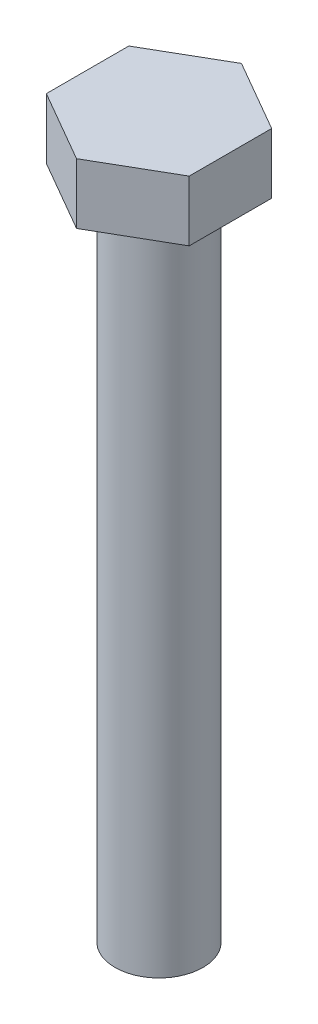
ISO-10303-21;
HEADER;
FILE_DESCRIPTION(('STEP AP214'),'2;1');
FILE_NAME('part.step','',(''),(''),'','','');
FILE_SCHEMA(('AUTOMOTIVE_DESIGN { 1 0 10303 214 1 1 1 1 }'));
ENDSEC;
DATA;
#1=APPLICATION_CONTEXT('core data for automotive mechanical design processes');
#2=APPLICATION_PROTOCOL_DEFINITION('international standard','automotive_design',2000,#1);
#3=PRODUCT_CONTEXT('',#1,'mechanical');
#4=PRODUCT('Part','Part','',(#3));
#5=PRODUCT_RELATED_PRODUCT_CATEGORY('part','',(#4));
#6=PRODUCT_DEFINITION_FORMATION('','',#4);
#7=PRODUCT_DEFINITION_CONTEXT('part definition',#1,'design');
#8=PRODUCT_DEFINITION('design','',#6,#7);
#9=PRODUCT_DEFINITION_SHAPE('','',#8);
#10=(LENGTH_UNIT() NAMED_UNIT(*) SI_UNIT(.MILLI.,.METRE.));
#11=(NAMED_UNIT(*) PLANE_ANGLE_UNIT() SI_UNIT($,.RADIAN.));
#12=(NAMED_UNIT(*) SI_UNIT($,.STERADIAN.) SOLID_ANGLE_UNIT());
#13=UNCERTAINTY_MEASURE_WITH_UNIT(LENGTH_MEASURE(1.E-05),#10,'distance_accuracy_value','');
#14=(GEOMETRIC_REPRESENTATION_CONTEXT(3) GLOBAL_UNCERTAINTY_ASSIGNED_CONTEXT((#13)) GLOBAL_UNIT_ASSIGNED_CONTEXT((#10,
#11,#12)) REPRESENTATION_CONTEXT('',''));
#15=CARTESIAN_POINT('',(0.,0.,0.));
#16=DIRECTION('',(0.,0.,1.));
#17=DIRECTION('',(1.,0.,0.));
#18=AXIS2_PLACEMENT_3D('',#15,#16,#17);
#19=CARTESIAN_POINT('',(6.5,5.5,3.75277674973257));
#20=DIRECTION('',(-1.,0.,0.));
#21=DIRECTION('',(0.,0.,1.));
#22=AXIS2_PLACEMENT_3D('',#19,#20,#21);
#23=PLANE('',#22);
#24=DIRECTION('',(0.,0.,-1.));
#25=VECTOR('',#24,1.);
#26=CARTESIAN_POINT('',(6.5,0.,3.75277674973257));
#27=LINE('',#26,#25);
#28=CARTESIAN_POINT('',(6.5,0.,3.75277674973257));
#29=VERTEX_POINT('',#28);
#30=CARTESIAN_POINT('',(6.5,0.,-3.75277674973257));
#31=VERTEX_POINT('',#30);
#32=EDGE_CURVE('E117',#29,#31,#27,.T.);
#33=ORIENTED_EDGE('',*,*,#32,.T.);
#34=DIRECTION('',(0.,-1.,0.));
#35=VECTOR('',#34,1.);
#36=CARTESIAN_POINT('',(6.5,5.5,-3.75277674973257));
#37=LINE('',#36,#35);
#38=CARTESIAN_POINT('',(6.5,5.5,-3.75277674973257));
#39=VERTEX_POINT('',#38);
#40=EDGE_CURVE('E11',#39,#31,#37,.T.);
#41=ORIENTED_EDGE('',*,*,#40,.F.);
#42=DIRECTION('',(0.,0.,-1.));
#43=VECTOR('',#42,1.);
#44=CARTESIAN_POINT('',(6.5,5.5,3.75277674973257));
#45=LINE('',#44,#43);
#46=CARTESIAN_POINT('',(6.5,5.5,3.75277674973257));
#47=VERTEX_POINT('',#46);
#48=EDGE_CURVE('E128',#47,#39,#45,.T.);
#49=ORIENTED_EDGE('',*,*,#48,.F.);
#50=DIRECTION('',(0.,-1.,0.));
#51=VECTOR('',#50,1.);
#52=CARTESIAN_POINT('',(6.5,5.5,3.75277674973257));
#53=LINE('',#52,#51);
#54=EDGE_CURVE('E113',#47,#29,#53,.T.);
#55=ORIENTED_EDGE('',*,*,#54,.T.);
#56=EDGE_LOOP('',(#33,#41,#49,#55));
#57=FACE_BOUND('',#56,.T.);
#58=ADVANCED_FACE('F33',(#57),#23,.F.);
#59=CARTESIAN_POINT('',(6.5,5.5,-3.75277674973257));
#60=DIRECTION('',(-0.5,0.,0.866025403784438));
#61=DIRECTION('',(0.866025403784439,0.,0.5));
#62=AXIS2_PLACEMENT_3D('',#59,#60,#61);
#63=PLANE('',#62);
#64=DIRECTION('',(-0.866025403784439,0.,-0.5));
#65=VECTOR('',#64,1.);
#66=CARTESIAN_POINT('',(6.5,0.,-3.75277674973257));
#67=LINE('',#66,#65);
#68=CARTESIAN_POINT('',(0.,0.,-7.50555349946514));
#69=VERTEX_POINT('',#68);
#70=EDGE_CURVE('E120',#31,#69,#67,.T.);
#71=ORIENTED_EDGE('',*,*,#70,.T.);
#72=DIRECTION('',(0.,-1.,0.));
#73=VECTOR('',#72,1.);
#74=CARTESIAN_POINT('',(0.,5.5,-7.50555349946514));
#75=LINE('',#74,#73);
#76=CARTESIAN_POINT('',(0.,5.5,-7.50555349946514));
#77=VERTEX_POINT('',#76);
#78=EDGE_CURVE('E41',#77,#69,#75,.T.);
#79=ORIENTED_EDGE('',*,*,#78,.F.);
#80=DIRECTION('',(-0.866025403784439,0.,-0.5));
#81=VECTOR('',#80,1.);
#82=CARTESIAN_POINT('',(6.5,5.5,-3.75277674973257));
#83=LINE('',#82,#81);
#84=EDGE_CURVE('E86',#39,#77,#83,.T.);
#85=ORIENTED_EDGE('',*,*,#84,.F.);
#86=ORIENTED_EDGE('',*,*,#40,.T.);
#87=EDGE_LOOP('',(#71,#79,#85,#86));
#88=FACE_BOUND('',#87,.T.);
#89=ADVANCED_FACE('F152',(#88),#63,.F.);
#90=CARTESIAN_POINT('',(0.,5.5,-7.50555349946514));
#91=DIRECTION('',(0.500000000000001,0.,0.866025403784438));
#92=DIRECTION('',(0.866025403784438,0.,-0.500000000000001));
#93=AXIS2_PLACEMENT_3D('',#90,#91,#92);
#94=PLANE('',#93);
#95=DIRECTION('',(-0.866025403784438,0.,0.5));
#96=VECTOR('',#95,1.);
#97=CARTESIAN_POINT('',(0.,0.,-7.50555349946514));
#98=LINE('',#97,#96);
#99=CARTESIAN_POINT('',(-6.5,0.,-3.75277674973257));
#100=VERTEX_POINT('',#99);
#101=EDGE_CURVE('E123',#69,#100,#98,.T.);
#102=ORIENTED_EDGE('',*,*,#101,.T.);
#103=DIRECTION('',(0.,-1.,0.));
#104=VECTOR('',#103,1.);
#105=CARTESIAN_POINT('',(-6.5,5.5,-3.75277674973257));
#106=LINE('',#105,#104);
#107=CARTESIAN_POINT('',(-6.5,5.5,-3.75277674973257));
#108=VERTEX_POINT('',#107);
#109=EDGE_CURVE('E108',#108,#100,#106,.T.);
#110=ORIENTED_EDGE('',*,*,#109,.F.);
#111=DIRECTION('',(-0.866025403784438,0.,0.5));
#112=VECTOR('',#111,1.);
#113=CARTESIAN_POINT('',(0.,5.5,-7.50555349946514));
#114=LINE('',#113,#112);
#115=EDGE_CURVE('E99',#77,#108,#114,.T.);
#116=ORIENTED_EDGE('',*,*,#115,.F.);
#117=ORIENTED_EDGE('',*,*,#78,.T.);
#118=EDGE_LOOP('',(#102,#110,#116,#117));
#119=FACE_BOUND('',#118,.T.);
#120=ADVANCED_FACE('F134',(#119),#94,.F.);
#121=CARTESIAN_POINT('',(-6.5,5.5,-3.75277674973257));
#122=DIRECTION('',(1.,0.,0.));
#123=DIRECTION('',(0.,0.,-1.));
#124=AXIS2_PLACEMENT_3D('',#121,#122,#123);
#125=PLANE('',#124);
#126=DIRECTION('',(0.,0.,1.));
#127=VECTOR('',#126,1.);
#128=CARTESIAN_POINT('',(-6.5,0.,-3.75277674973257));
#129=LINE('',#128,#127);
#130=CARTESIAN_POINT('',(-6.5,0.,3.75277674973257));
#131=VERTEX_POINT('',#130);
#132=EDGE_CURVE('E107',#100,#131,#129,.T.);
#133=ORIENTED_EDGE('',*,*,#132,.T.);
#134=DIRECTION('',(0.,-1.,0.));
#135=VECTOR('',#134,1.);
#136=CARTESIAN_POINT('',(-6.5,5.5,3.75277674973257));
#137=LINE('',#136,#135);
#138=CARTESIAN_POINT('',(-6.5,5.5,3.75277674973257));
#139=VERTEX_POINT('',#138);
#140=EDGE_CURVE('E104',#139,#131,#137,.T.);
#141=ORIENTED_EDGE('',*,*,#140,.F.);
#142=DIRECTION('',(0.,0.,1.));
#143=VECTOR('',#142,1.);
#144=CARTESIAN_POINT('',(-6.5,5.5,-3.75277674973257));
#145=LINE('',#144,#143);
#146=EDGE_CURVE('E93',#108,#139,#145,.T.);
#147=ORIENTED_EDGE('',*,*,#146,.F.);
#148=ORIENTED_EDGE('',*,*,#109,.T.);
#149=EDGE_LOOP('',(#133,#141,#147,#148));
#150=FACE_BOUND('',#149,.T.);
#151=ADVANCED_FACE('F105',(#150),#125,.F.);
#152=CARTESIAN_POINT('',(-6.5,5.5,3.75277674973257));
#153=DIRECTION('',(0.5,0.,-0.866025403784438));
#154=DIRECTION('',(-0.866025403784439,0.,-0.5));
#155=AXIS2_PLACEMENT_3D('',#152,#153,#154);
#156=PLANE('',#155);
#157=DIRECTION('',(0.866025403784439,0.,0.5));
#158=VECTOR('',#157,1.);
#159=CARTESIAN_POINT('',(-6.5,0.,3.75277674973257));
#160=LINE('',#159,#158);
#161=CARTESIAN_POINT('',(0.,0.,7.50555349946514));
#162=VERTEX_POINT('',#161);
#163=EDGE_CURVE('E72',#131,#162,#160,.T.);
#164=ORIENTED_EDGE('',*,*,#163,.T.);
#165=DIRECTION('',(0.,-1.,0.));
#166=VECTOR('',#165,1.);
#167=CARTESIAN_POINT('',(0.,5.5,7.50555349946514));
#168=LINE('',#167,#166);
#169=CARTESIAN_POINT('',(0.,5.5,7.50555349946514));
#170=VERTEX_POINT('',#169);
#171=EDGE_CURVE('E109',#170,#162,#168,.T.);
#172=ORIENTED_EDGE('',*,*,#171,.F.);
#173=DIRECTION('',(0.866025403784439,0.,0.5));
#174=VECTOR('',#173,1.);
#175=CARTESIAN_POINT('',(-6.5,5.5,3.75277674973257));
#176=LINE('',#175,#174);
#177=EDGE_CURVE('E97',#139,#170,#176,.T.);
#178=ORIENTED_EDGE('',*,*,#177,.F.);
#179=ORIENTED_EDGE('',*,*,#140,.T.);
#180=EDGE_LOOP('',(#164,#172,#178,#179));
#181=FACE_BOUND('',#180,.T.);
#182=ADVANCED_FACE('F111',(#181),#156,.F.);
#183=CARTESIAN_POINT('',(0.,5.5,7.50555349946514));
#184=DIRECTION('',(-0.5,0.,-0.866025403784438));
#185=DIRECTION('',(-0.866025403784438,0.,0.5));
#186=AXIS2_PLACEMENT_3D('',#183,#184,#185);
#187=PLANE('',#186);
#188=DIRECTION('',(0.866025403784438,0.,-0.5));
#189=VECTOR('',#188,1.);
#190=CARTESIAN_POINT('',(0.,0.,7.50555349946514));
#191=LINE('',#190,#189);
#192=EDGE_CURVE('E78',#162,#29,#191,.T.);
#193=ORIENTED_EDGE('',*,*,#192,.T.);
#194=ORIENTED_EDGE('',*,*,#54,.F.);
#195=DIRECTION('',(0.866025403784438,0.,-0.5));
#196=VECTOR('',#195,1.);
#197=CARTESIAN_POINT('',(0.,5.5,7.50555349946514));
#198=LINE('',#197,#196);
#199=EDGE_CURVE('E49',#170,#47,#198,.T.);
#200=ORIENTED_EDGE('',*,*,#199,.F.);
#201=ORIENTED_EDGE('',*,*,#171,.T.);
#202=EDGE_LOOP('',(#193,#194,#200,#201));
#203=FACE_BOUND('',#202,.T.);
#204=ADVANCED_FACE('F141',(#203),#187,.F.);
#205=CARTESIAN_POINT('',(0.,5.5,0.));
#206=DIRECTION('',(0.,1.,0.));
#207=DIRECTION('',(0.,0.,1.));
#208=AXIS2_PLACEMENT_3D('',#205,#206,#207);
#209=PLANE('',#208);
#210=ORIENTED_EDGE('',*,*,#48,.T.);
#211=ORIENTED_EDGE('',*,*,#84,.T.);
#212=ORIENTED_EDGE('',*,*,#115,.T.);
#213=ORIENTED_EDGE('',*,*,#146,.T.);
#214=ORIENTED_EDGE('',*,*,#177,.T.);
#215=ORIENTED_EDGE('',*,*,#199,.T.);
#216=EDGE_LOOP('',(#210,#211,#212,#213,#214,#215));
#217=FACE_BOUND('',#216,.T.);
#218=ADVANCED_FACE('F95',(#217),#209,.T.);
#219=CARTESIAN_POINT('',(0.,0.,0.));
#220=DIRECTION('',(0.,1.,0.));
#221=DIRECTION('',(0.,0.,1.));
#222=AXIS2_PLACEMENT_3D('',#219,#220,#221);
#223=PLANE('',#222);
#224=CARTESIAN_POINT('',(0.,0.,0.));
#225=DIRECTION('',(0.,1.,0.));
#226=DIRECTION('',(0.,0.,1.));
#227=AXIS2_PLACEMENT_3D('',#224,#225,#226);
#228=CIRCLE('',#227,4.);
#229=CARTESIAN_POINT('',(0.,0.,4.));
#230=VERTEX_POINT('',#229);
#231=EDGE_CURVE('E214',#230,#230,#228,.T.);
#232=ORIENTED_EDGE('',*,*,#231,.T.);
#233=EDGE_LOOP('',(#232));
#234=FACE_BOUND('',#233,.T.);
#235=ORIENTED_EDGE('',*,*,#32,.F.);
#236=ORIENTED_EDGE('',*,*,#192,.F.);
#237=ORIENTED_EDGE('',*,*,#163,.F.);
#238=ORIENTED_EDGE('',*,*,#132,.F.);
#239=ORIENTED_EDGE('',*,*,#101,.F.);
#240=ORIENTED_EDGE('',*,*,#70,.F.);
#241=EDGE_LOOP('',(#235,#236,#237,#238,#239,#240));
#242=FACE_BOUND('',#241,.T.);
#243=ADVANCED_FACE('F137',(#234,#242),#223,.F.);
#244=CARTESIAN_POINT('',(0.,-60.,0.));
#245=DIRECTION('',(0.,1.,0.));
#246=DIRECTION('',(0.,0.,1.));
#247=AXIS2_PLACEMENT_3D('',#244,#245,#246);
#248=CYLINDRICAL_SURFACE('',#247,4.);
#249=CARTESIAN_POINT('',(0.,-60.,0.));
#250=DIRECTION('',(0.,1.,0.));
#251=DIRECTION('',(0.,0.,1.));
#252=AXIS2_PLACEMENT_3D('',#249,#250,#251);
#253=CIRCLE('',#252,4.);
#254=CARTESIAN_POINT('',(0.,-60.,4.));
#255=VERTEX_POINT('',#254);
#256=EDGE_CURVE('E121',#255,#255,#253,.T.);
#257=ORIENTED_EDGE('',*,*,#256,.T.);
#258=EDGE_LOOP('',(#257));
#259=FACE_BOUND('',#258,.T.);
#260=ORIENTED_EDGE('',*,*,#231,.F.);
#261=EDGE_LOOP('',(#260));
#262=FACE_BOUND('',#261,.T.);
#263=ADVANCED_FACE('F189',(#259,#262),#248,.T.);
#264=CARTESIAN_POINT('',(0.,-60.,0.));
#265=DIRECTION('',(0.,1.,0.));
#266=DIRECTION('',(0.,0.,1.));
#267=AXIS2_PLACEMENT_3D('',#264,#265,#266);
#268=PLANE('',#267);
#269=ORIENTED_EDGE('',*,*,#256,.F.);
#270=EDGE_LOOP('',(#269));
#271=FACE_BOUND('',#270,.T.);
#272=ADVANCED_FACE('F198',(#271),#268,.F.);
#273=CLOSED_SHELL('',(#58,#89,#120,#151,#182,#204,#218,#243,#263,#272));
#274=MANIFOLD_SOLID_BREP('B2',#273);
#275=ADVANCED_BREP_SHAPE_REPRESENTATION('',(#18,#274),#14);
#276=SHAPE_DEFINITION_REPRESENTATION(#9,#275);
ENDSEC;
END-ISO-10303-21;
